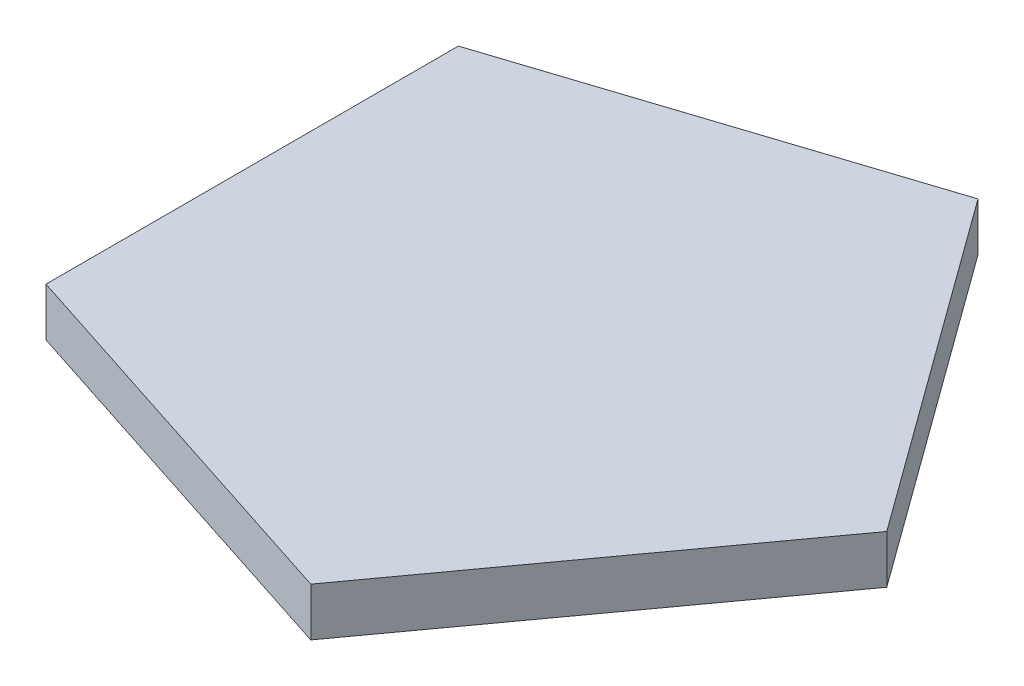
ISO-10303-21;
HEADER;
FILE_DESCRIPTION(('STEP AP214'),'2;1');
FILE_NAME('part.step','',(''),(''),'','','');
FILE_SCHEMA(('AUTOMOTIVE_DESIGN { 1 0 10303 214 1 1 1 1 }'));
ENDSEC;
DATA;
#1=APPLICATION_CONTEXT('core data for automotive mechanical design processes');
#2=APPLICATION_PROTOCOL_DEFINITION('international standard','automotive_design',2000,#1);
#3=PRODUCT_CONTEXT('',#1,'mechanical');
#4=PRODUCT('Part','Part','',(#3));
#5=PRODUCT_RELATED_PRODUCT_CATEGORY('part','',(#4));
#6=PRODUCT_DEFINITION_FORMATION('','',#4);
#7=PRODUCT_DEFINITION_CONTEXT('part definition',#1,'design');
#8=PRODUCT_DEFINITION('design','',#6,#7);
#9=PRODUCT_DEFINITION_SHAPE('','',#8);
#10=(LENGTH_UNIT() NAMED_UNIT(*) SI_UNIT(.MILLI.,.METRE.));
#11=(NAMED_UNIT(*) PLANE_ANGLE_UNIT() SI_UNIT($,.RADIAN.));
#12=(NAMED_UNIT(*) SI_UNIT($,.STERADIAN.) SOLID_ANGLE_UNIT());
#13=UNCERTAINTY_MEASURE_WITH_UNIT(LENGTH_MEASURE(1.E-05),#10,'distance_accuracy_value','');
#14=(GEOMETRIC_REPRESENTATION_CONTEXT(3) GLOBAL_UNCERTAINTY_ASSIGNED_CONTEXT((#13)) GLOBAL_UNIT_ASSIGNED_CONTEXT((#10,
#11,#12)) REPRESENTATION_CONTEXT('',''));
#15=CARTESIAN_POINT('',(0.,0.,0.));
#16=DIRECTION('',(0.,0.,1.));
#17=DIRECTION('',(1.,0.,0.));
#18=AXIS2_PLACEMENT_3D('',#15,#16,#17);
#19=CARTESIAN_POINT('',(16.8233955878123,7.5,51.7770876399966));
#20=DIRECTION('',(-0.809016994374947,0.,-0.587785252292473));
#21=DIRECTION('',(-0.587785252292473,0.,0.809016994374948));
#22=AXIS2_PLACEMENT_3D('',#19,#20,#21);
#23=PLANE('',#22);
#24=DIRECTION('',(0.587785252292473,0.,-0.809016994374948));
#25=VECTOR('',#24,1.);
#26=CARTESIAN_POINT('',(16.8233955878123,0.,51.7770876399966));
#27=LINE('',#26,#25);
#28=CARTESIAN_POINT('',(16.8233955878123,0.,51.7770876399966));
#29=VERTEX_POINT('',#28);
#30=CARTESIAN_POINT('',(54.4416517345306,0.,0.));
#31=VERTEX_POINT('',#30);
#32=EDGE_CURVE('E110',#29,#31,#27,.T.);
#33=ORIENTED_EDGE('',*,*,#32,.T.);
#34=DIRECTION('',(0.,-1.,0.));
#35=VECTOR('',#34,1.);
#36=CARTESIAN_POINT('',(54.4416517345306,7.5,0.));
#37=LINE('',#36,#35);
#38=CARTESIAN_POINT('',(54.4416517345306,7.5,0.));
#39=VERTEX_POINT('',#38);
#40=EDGE_CURVE('E11',#39,#31,#37,.T.);
#41=ORIENTED_EDGE('',*,*,#40,.F.);
#42=DIRECTION('',(0.587785252292473,0.,-0.809016994374948));
#43=VECTOR('',#42,1.);
#44=CARTESIAN_POINT('',(16.8233955878123,7.5,51.7770876399966));
#45=LINE('',#44,#43);
#46=CARTESIAN_POINT('',(16.8233955878123,7.5,51.7770876399966));
#47=VERTEX_POINT('',#46);
#48=EDGE_CURVE('E118',#47,#39,#45,.T.);
#49=ORIENTED_EDGE('',*,*,#48,.F.);
#50=DIRECTION('',(0.,-1.,0.));
#51=VECTOR('',#50,1.);
#52=CARTESIAN_POINT('',(16.8233955878123,7.5,51.7770876399966));
#53=LINE('',#52,#51);
#54=EDGE_CURVE('E106',#47,#29,#53,.T.);
#55=ORIENTED_EDGE('',*,*,#54,.T.);
#56=EDGE_LOOP('',(#33,#41,#49,#55));
#57=FACE_BOUND('',#56,.T.);
#58=ADVANCED_FACE('F36',(#57),#23,.F.);
#59=CARTESIAN_POINT('',(54.4416517345306,7.5,0.));
#60=DIRECTION('',(-0.809016994374947,0.,0.587785252292473));
#61=DIRECTION('',(0.587785252292473,0.,0.809016994374947));
#62=AXIS2_PLACEMENT_3D('',#59,#60,#61);
#63=PLANE('',#62);
#64=DIRECTION('',(-0.587785252292473,0.,-0.809016994374947));
#65=VECTOR('',#64,1.);
#66=CARTESIAN_POINT('',(54.4416517345306,0.,0.));
#67=LINE('',#66,#65);
#68=CARTESIAN_POINT('',(16.8233955878123,0.,-51.7770876399967));
#69=VERTEX_POINT('',#68);
#70=EDGE_CURVE('E113',#31,#69,#67,.T.);
#71=ORIENTED_EDGE('',*,*,#70,.T.);
#72=DIRECTION('',(0.,-1.,0.));
#73=VECTOR('',#72,1.);
#74=CARTESIAN_POINT('',(16.8233955878123,7.5,-51.7770876399967));
#75=LINE('',#74,#73);
#76=CARTESIAN_POINT('',(16.8233955878123,7.5,-51.7770876399967));
#77=VERTEX_POINT('',#76);
#78=EDGE_CURVE('E44',#77,#69,#75,.T.);
#79=ORIENTED_EDGE('',*,*,#78,.F.);
#80=DIRECTION('',(-0.587785252292473,0.,-0.809016994374947));
#81=VECTOR('',#80,1.);
#82=CARTESIAN_POINT('',(54.4416517345306,7.5,0.));
#83=LINE('',#82,#81);
#84=EDGE_CURVE('E86',#39,#77,#83,.T.);
#85=ORIENTED_EDGE('',*,*,#84,.F.);
#86=ORIENTED_EDGE('',*,*,#40,.T.);
#87=EDGE_LOOP('',(#71,#79,#85,#86));
#88=FACE_BOUND('',#87,.T.);
#89=ADVANCED_FACE('F137',(#88),#63,.F.);
#90=CARTESIAN_POINT('',(16.8233955878123,7.5,-51.7770876399967));
#91=DIRECTION('',(0.309016994374948,0.,0.951056516295154));
#92=DIRECTION('',(0.951056516295154,0.,-0.309016994374948));
#93=AXIS2_PLACEMENT_3D('',#90,#91,#92);
#94=PLANE('',#93);
#95=DIRECTION('',(-0.951056516295154,0.,0.309016994374948));
#96=VECTOR('',#95,1.);
#97=CARTESIAN_POINT('',(16.8233955878123,0.,-51.7770876399967));
#98=LINE('',#97,#96);
#99=CARTESIAN_POINT('',(-44.0442214550775,0.,-32.));
#100=VERTEX_POINT('',#99);
#101=EDGE_CURVE('E101',#69,#100,#98,.T.);
#102=ORIENTED_EDGE('',*,*,#101,.T.);
#103=DIRECTION('',(0.,-1.,0.));
#104=VECTOR('',#103,1.);
#105=CARTESIAN_POINT('',(-44.0442214550775,7.5,-32.));
#106=LINE('',#105,#104);
#107=CARTESIAN_POINT('',(-44.0442214550775,7.5,-32.));
#108=VERTEX_POINT('',#107);
#109=EDGE_CURVE('E98',#108,#100,#106,.T.);
#110=ORIENTED_EDGE('',*,*,#109,.F.);
#111=DIRECTION('',(-0.951056516295154,0.,0.309016994374948));
#112=VECTOR('',#111,1.);
#113=CARTESIAN_POINT('',(16.8233955878123,7.5,-51.7770876399967));
#114=LINE('',#113,#112);
#115=EDGE_CURVE('E90',#77,#108,#114,.T.);
#116=ORIENTED_EDGE('',*,*,#115,.F.);
#117=ORIENTED_EDGE('',*,*,#78,.T.);
#118=EDGE_LOOP('',(#102,#110,#116,#117));
#119=FACE_BOUND('',#118,.T.);
#120=ADVANCED_FACE('F99',(#119),#94,.F.);
#121=CARTESIAN_POINT('',(-44.0442214550775,7.5,-32.));
#122=DIRECTION('',(1.,0.,0.));
#123=DIRECTION('',(0.,0.,-1.));
#124=AXIS2_PLACEMENT_3D('',#121,#122,#123);
#125=PLANE('',#124);
#126=DIRECTION('',(0.,0.,1.));
#127=VECTOR('',#126,1.);
#128=CARTESIAN_POINT('',(-44.0442214550775,0.,-32.));
#129=LINE('',#128,#127);
#130=CARTESIAN_POINT('',(-44.0442214550775,0.,32.));
#131=VERTEX_POINT('',#130);
#132=EDGE_CURVE('E72',#100,#131,#129,.T.);
#133=ORIENTED_EDGE('',*,*,#132,.T.);
#134=DIRECTION('',(0.,-1.,0.));
#135=VECTOR('',#134,1.);
#136=CARTESIAN_POINT('',(-44.0442214550775,7.5,32.));
#137=LINE('',#136,#135);
#138=CARTESIAN_POINT('',(-44.0442214550775,7.5,32.));
#139=VERTEX_POINT('',#138);
#140=EDGE_CURVE('E102',#139,#131,#137,.T.);
#141=ORIENTED_EDGE('',*,*,#140,.F.);
#142=DIRECTION('',(0.,0.,1.));
#143=VECTOR('',#142,1.);
#144=CARTESIAN_POINT('',(-44.0442214550775,7.5,-32.));
#145=LINE('',#144,#143);
#146=EDGE_CURVE('E94',#108,#139,#145,.T.);
#147=ORIENTED_EDGE('',*,*,#146,.F.);
#148=ORIENTED_EDGE('',*,*,#109,.T.);
#149=EDGE_LOOP('',(#133,#141,#147,#148));
#150=FACE_BOUND('',#149,.T.);
#151=ADVANCED_FACE('F104',(#150),#125,.F.);
#152=CARTESIAN_POINT('',(-44.0442214550775,7.5,32.));
#153=DIRECTION('',(0.309016994374948,0.,-0.951056516295154));
#154=DIRECTION('',(-0.951056516295154,0.,-0.309016994374948));
#155=AXIS2_PLACEMENT_3D('',#152,#153,#154);
#156=PLANE('',#155);
#157=DIRECTION('',(0.951056516295154,0.,0.309016994374948));
#158=VECTOR('',#157,1.);
#159=CARTESIAN_POINT('',(-44.0442214550775,0.,32.));
#160=LINE('',#159,#158);
#161=EDGE_CURVE('E78',#131,#29,#160,.T.);
#162=ORIENTED_EDGE('',*,*,#161,.T.);
#163=ORIENTED_EDGE('',*,*,#54,.F.);
#164=DIRECTION('',(0.951056516295154,0.,0.309016994374948));
#165=VECTOR('',#164,1.);
#166=CARTESIAN_POINT('',(-44.0442214550775,7.5,32.));
#167=LINE('',#166,#165);
#168=EDGE_CURVE('E52',#139,#47,#167,.T.);
#169=ORIENTED_EDGE('',*,*,#168,.F.);
#170=ORIENTED_EDGE('',*,*,#140,.T.);
#171=EDGE_LOOP('',(#162,#163,#169,#170));
#172=FACE_BOUND('',#171,.T.);
#173=ADVANCED_FACE('F126',(#172),#156,.F.);
#174=CARTESIAN_POINT('',(0.,7.5,0.));
#175=DIRECTION('',(0.,1.,0.));
#176=DIRECTION('',(0.,0.,1.));
#177=AXIS2_PLACEMENT_3D('',#174,#175,#176);
#178=PLANE('',#177);
#179=ORIENTED_EDGE('',*,*,#48,.T.);
#180=ORIENTED_EDGE('',*,*,#84,.T.);
#181=ORIENTED_EDGE('',*,*,#115,.T.);
#182=ORIENTED_EDGE('',*,*,#146,.T.);
#183=ORIENTED_EDGE('',*,*,#168,.T.);
#184=EDGE_LOOP('',(#179,#180,#181,#182,#183));
#185=FACE_BOUND('',#184,.T.);
#186=ADVANCED_FACE('F92',(#185),#178,.T.);
#187=CARTESIAN_POINT('',(0.,0.,0.));
#188=DIRECTION('',(0.,1.,0.));
#189=DIRECTION('',(0.,0.,1.));
#190=AXIS2_PLACEMENT_3D('',#187,#188,#189);
#191=PLANE('',#190);
#192=ORIENTED_EDGE('',*,*,#32,.F.);
#193=ORIENTED_EDGE('',*,*,#161,.F.);
#194=ORIENTED_EDGE('',*,*,#132,.F.);
#195=ORIENTED_EDGE('',*,*,#101,.F.);
#196=ORIENTED_EDGE('',*,*,#70,.F.);
#197=EDGE_LOOP('',(#192,#193,#194,#195,#196));
#198=FACE_BOUND('',#197,.T.);
#199=ADVANCED_FACE('F122',(#198),#191,.F.);
#200=CLOSED_SHELL('',(#58,#89,#120,#151,#173,#186,#199));
#201=MANIFOLD_SOLID_BREP('B2',#200);
#202=ADVANCED_BREP_SHAPE_REPRESENTATION('',(#18,#201),#14);
#203=SHAPE_DEFINITION_REPRESENTATION(#9,#202);
ENDSEC;
END-ISO-10303-21;
